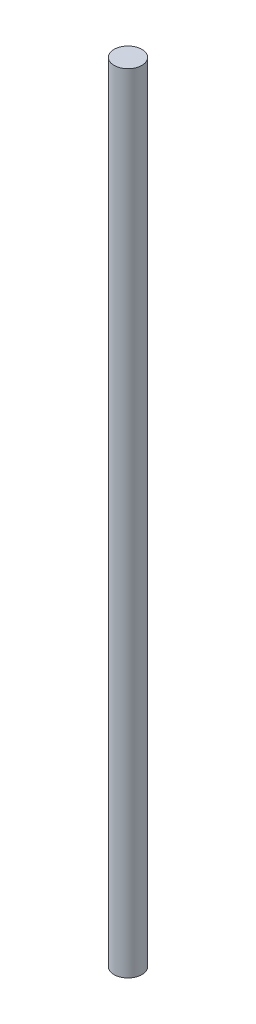
ISO-10303-21;
HEADER;
FILE_DESCRIPTION(('STEP AP214'),'2;1');
FILE_NAME('part.step','',(''),(''),'','','');
FILE_SCHEMA(('AUTOMOTIVE_DESIGN { 1 0 10303 214 1 1 1 1 }'));
ENDSEC;
DATA;
#1=APPLICATION_CONTEXT('core data for automotive mechanical design processes');
#2=APPLICATION_PROTOCOL_DEFINITION('international standard','automotive_design',2000,#1);
#3=PRODUCT_CONTEXT('',#1,'mechanical');
#4=PRODUCT('Part','Part','',(#3));
#5=PRODUCT_RELATED_PRODUCT_CATEGORY('part','',(#4));
#6=PRODUCT_DEFINITION_FORMATION('','',#4);
#7=PRODUCT_DEFINITION_CONTEXT('part definition',#1,'design');
#8=PRODUCT_DEFINITION('design','',#6,#7);
#9=PRODUCT_DEFINITION_SHAPE('','',#8);
#10=(LENGTH_UNIT() NAMED_UNIT(*) SI_UNIT(.MILLI.,.METRE.));
#11=(NAMED_UNIT(*) PLANE_ANGLE_UNIT() SI_UNIT($,.RADIAN.));
#12=(NAMED_UNIT(*) SI_UNIT($,.STERADIAN.) SOLID_ANGLE_UNIT());
#13=UNCERTAINTY_MEASURE_WITH_UNIT(LENGTH_MEASURE(1.E-05),#10,'distance_accuracy_value','');
#14=(GEOMETRIC_REPRESENTATION_CONTEXT(3) GLOBAL_UNCERTAINTY_ASSIGNED_CONTEXT((#13)) GLOBAL_UNIT_ASSIGNED_CONTEXT((#10,
#11,#12)) REPRESENTATION_CONTEXT('',''));
#15=CARTESIAN_POINT('',(0.,0.,0.));
#16=DIRECTION('',(0.,0.,1.));
#17=DIRECTION('',(1.,0.,0.));
#18=AXIS2_PLACEMENT_3D('',#15,#16,#17);
#19=CARTESIAN_POINT('',(0.,596.9,0.));
#20=DIRECTION('',(0.,-1.,0.));
#21=DIRECTION('',(0.,0.,-1.));
#22=AXIS2_PLACEMENT_3D('',#19,#20,#21);
#23=CYLINDRICAL_SURFACE('',#22,21.082);
#24=CARTESIAN_POINT('',(0.,596.9,0.));
#25=DIRECTION('',(0.,1.,0.));
#26=DIRECTION('',(0.,0.,1.));
#27=AXIS2_PLACEMENT_3D('',#24,#25,#26);
#28=CIRCLE('',#27,21.082);
#29=CARTESIAN_POINT('',(0.,596.9,21.082));
#30=VERTEX_POINT('',#29);
#31=EDGE_CURVE('E10',#30,#30,#28,.T.);
#32=ORIENTED_EDGE('',*,*,#31,.F.);
#33=EDGE_LOOP('',(#32));
#34=FACE_BOUND('',#33,.T.);
#35=CARTESIAN_POINT('',(0.,-596.9,0.));
#36=DIRECTION('',(0.,1.,0.));
#37=DIRECTION('',(0.,0.,1.));
#38=AXIS2_PLACEMENT_3D('',#35,#36,#37);
#39=CIRCLE('',#38,21.082);
#40=CARTESIAN_POINT('',(0.,-596.9,21.082));
#41=VERTEX_POINT('',#40);
#42=EDGE_CURVE('E46',#41,#41,#39,.T.);
#43=ORIENTED_EDGE('',*,*,#42,.T.);
#44=EDGE_LOOP('',(#43));
#45=FACE_BOUND('',#44,.T.);
#46=ADVANCED_FACE('F43',(#34,#45),#23,.T.);
#47=CARTESIAN_POINT('',(0.,596.9,0.));
#48=DIRECTION('',(0.,1.,0.));
#49=DIRECTION('',(0.,0.,1.));
#50=AXIS2_PLACEMENT_3D('',#47,#48,#49);
#51=PLANE('',#50);
#52=ORIENTED_EDGE('',*,*,#31,.T.);
#53=EDGE_LOOP('',(#52));
#54=FACE_BOUND('',#53,.T.);
#55=ADVANCED_FACE('F60',(#54),#51,.T.);
#56=CARTESIAN_POINT('',(0.,-596.9,0.));
#57=DIRECTION('',(0.,1.,0.));
#58=DIRECTION('',(0.,0.,1.));
#59=AXIS2_PLACEMENT_3D('',#56,#57,#58);
#60=PLANE('',#59);
#61=ORIENTED_EDGE('',*,*,#42,.F.);
#62=EDGE_LOOP('',(#61));
#63=FACE_BOUND('',#62,.T.);
#64=ADVANCED_FACE('F58',(#63),#60,.F.);
#65=CLOSED_SHELL('',(#46,#55,#64));
#66=MANIFOLD_SOLID_BREP('B2',#65);
#67=ADVANCED_BREP_SHAPE_REPRESENTATION('',(#18,#66),#14);
#68=SHAPE_DEFINITION_REPRESENTATION(#9,#67);
ENDSEC;
END-ISO-10303-21;
